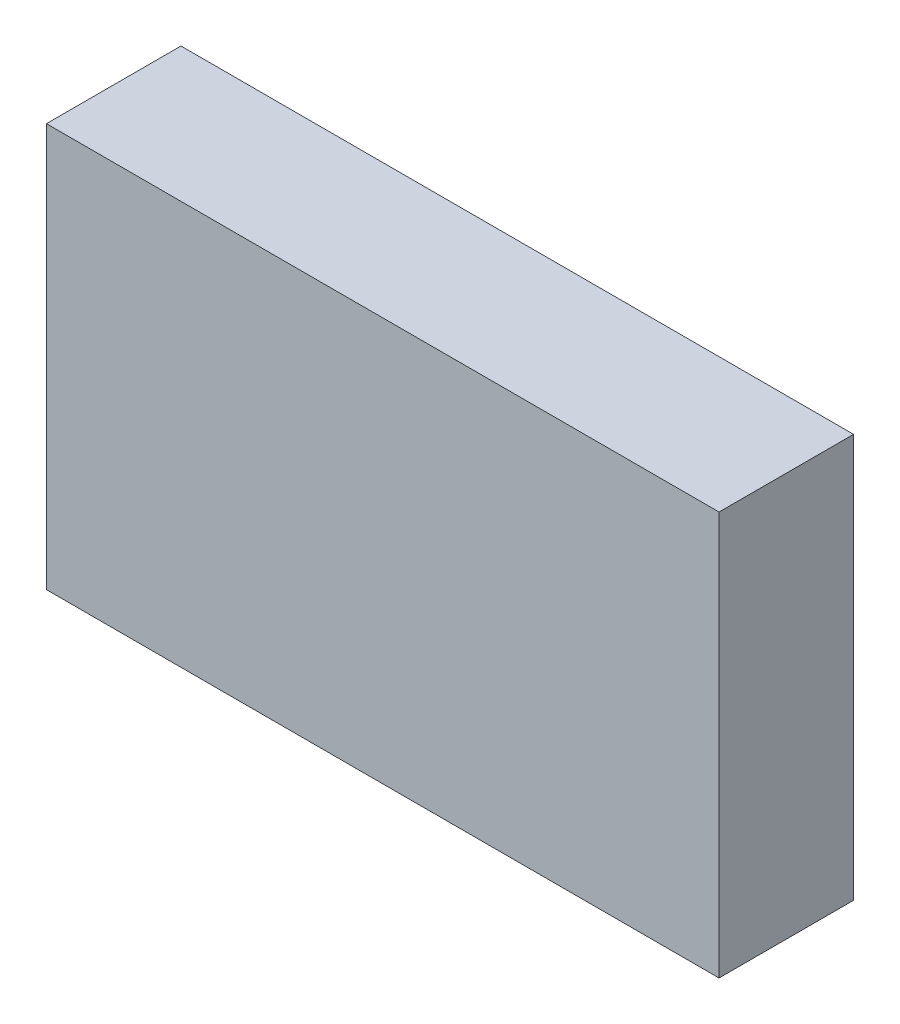
ISO-10303-21;
HEADER;
FILE_DESCRIPTION(('STEP AP214'),'2;1');
FILE_NAME('part.step','',(''),(''),'','','');
FILE_SCHEMA(('AUTOMOTIVE_DESIGN { 1 0 10303 214 1 1 1 1 }'));
ENDSEC;
DATA;
#1=APPLICATION_CONTEXT('core data for automotive mechanical design processes');
#2=APPLICATION_PROTOCOL_DEFINITION('international standard','automotive_design',2000,#1);
#3=PRODUCT_CONTEXT('',#1,'mechanical');
#4=PRODUCT('Part','Part','',(#3));
#5=PRODUCT_RELATED_PRODUCT_CATEGORY('part','',(#4));
#6=PRODUCT_DEFINITION_FORMATION('','',#4);
#7=PRODUCT_DEFINITION_CONTEXT('part definition',#1,'design');
#8=PRODUCT_DEFINITION('design','',#6,#7);
#9=PRODUCT_DEFINITION_SHAPE('','',#8);
#10=(LENGTH_UNIT() NAMED_UNIT(*) SI_UNIT(.MILLI.,.METRE.));
#11=(NAMED_UNIT(*) PLANE_ANGLE_UNIT() SI_UNIT($,.RADIAN.));
#12=(NAMED_UNIT(*) SI_UNIT($,.STERADIAN.) SOLID_ANGLE_UNIT());
#13=UNCERTAINTY_MEASURE_WITH_UNIT(LENGTH_MEASURE(1.E-05),#10,'distance_accuracy_value','');
#14=(GEOMETRIC_REPRESENTATION_CONTEXT(3) GLOBAL_UNCERTAINTY_ASSIGNED_CONTEXT((#13)) GLOBAL_UNIT_ASSIGNED_CONTEXT((#10,
#11,#12)) REPRESENTATION_CONTEXT('',''));
#15=CARTESIAN_POINT('',(0.,0.,0.));
#16=DIRECTION('',(0.,0.,1.));
#17=DIRECTION('',(1.,0.,0.));
#18=AXIS2_PLACEMENT_3D('',#15,#16,#17);
#19=CARTESIAN_POINT('',(0.,0.,20.));
#20=DIRECTION('',(1.,0.,0.));
#21=DIRECTION('',(0.,0.,-1.));
#22=AXIS2_PLACEMENT_3D('',#19,#20,#21);
#23=PLANE('',#22);
#24=DIRECTION('',(0.,-1.,0.));
#25=VECTOR('',#24,1.);
#26=CARTESIAN_POINT('',(0.,0.,0.));
#27=LINE('',#26,#25);
#28=CARTESIAN_POINT('',(0.,60.,0.));
#29=VERTEX_POINT('',#28);
#30=CARTESIAN_POINT('',(0.,0.,0.));
#31=VERTEX_POINT('',#30);
#32=EDGE_CURVE('E102',#29,#31,#27,.T.);
#33=ORIENTED_EDGE('',*,*,#32,.T.);
#34=DIRECTION('',(0.,0.,-1.));
#35=VECTOR('',#34,1.);
#36=CARTESIAN_POINT('',(0.,0.,20.));
#37=LINE('',#36,#35);
#38=CARTESIAN_POINT('',(0.,0.,20.));
#39=VERTEX_POINT('',#38);
#40=EDGE_CURVE('E11',#39,#31,#37,.T.);
#41=ORIENTED_EDGE('',*,*,#40,.F.);
#42=DIRECTION('',(0.,-1.,0.));
#43=VECTOR('',#42,1.);
#44=CARTESIAN_POINT('',(0.,0.,20.));
#45=LINE('',#44,#43);
#46=CARTESIAN_POINT('',(0.,60.,20.));
#47=VERTEX_POINT('',#46);
#48=EDGE_CURVE('E90',#47,#39,#45,.T.);
#49=ORIENTED_EDGE('',*,*,#48,.F.);
#50=DIRECTION('',(0.,0.,-1.));
#51=VECTOR('',#50,1.);
#52=CARTESIAN_POINT('',(0.,60.,20.));
#53=LINE('',#52,#51);
#54=EDGE_CURVE('E98',#47,#29,#53,.T.);
#55=ORIENTED_EDGE('',*,*,#54,.T.);
#56=EDGE_LOOP('',(#33,#41,#49,#55));
#57=FACE_BOUND('',#56,.T.);
#58=ADVANCED_FACE('F39',(#57),#23,.F.);
#59=CARTESIAN_POINT('',(0.,0.,20.));
#60=DIRECTION('',(0.,1.,0.));
#61=DIRECTION('',(0.,0.,1.));
#62=AXIS2_PLACEMENT_3D('',#59,#60,#61);
#63=PLANE('',#62);
#64=DIRECTION('',(1.,0.,0.));
#65=VECTOR('',#64,1.);
#66=CARTESIAN_POINT('',(0.,0.,0.));
#67=LINE('',#66,#65);
#68=CARTESIAN_POINT('',(100.,0.,0.));
#69=VERTEX_POINT('',#68);
#70=EDGE_CURVE('E94',#31,#69,#67,.T.);
#71=ORIENTED_EDGE('',*,*,#70,.T.);
#72=DIRECTION('',(0.,0.,-1.));
#73=VECTOR('',#72,1.);
#74=CARTESIAN_POINT('',(100.,0.,20.));
#75=LINE('',#74,#73);
#76=CARTESIAN_POINT('',(100.,0.,20.));
#77=VERTEX_POINT('',#76);
#78=EDGE_CURVE('E47',#77,#69,#75,.T.);
#79=ORIENTED_EDGE('',*,*,#78,.F.);
#80=DIRECTION('',(1.,0.,0.));
#81=VECTOR('',#80,1.);
#82=CARTESIAN_POINT('',(0.,0.,20.));
#83=LINE('',#82,#81);
#84=EDGE_CURVE('E85',#39,#77,#83,.T.);
#85=ORIENTED_EDGE('',*,*,#84,.F.);
#86=ORIENTED_EDGE('',*,*,#40,.T.);
#87=EDGE_LOOP('',(#71,#79,#85,#86));
#88=FACE_BOUND('',#87,.T.);
#89=ADVANCED_FACE('F93',(#88),#63,.F.);
#90=CARTESIAN_POINT('',(100.,0.,20.));
#91=DIRECTION('',(-1.,0.,0.));
#92=DIRECTION('',(0.,0.,1.));
#93=AXIS2_PLACEMENT_3D('',#90,#91,#92);
#94=PLANE('',#93);
#95=DIRECTION('',(0.,1.,0.));
#96=VECTOR('',#95,1.);
#97=CARTESIAN_POINT('',(100.,0.,0.));
#98=LINE('',#97,#96);
#99=CARTESIAN_POINT('',(100.,60.,0.));
#100=VERTEX_POINT('',#99);
#101=EDGE_CURVE('E72',#69,#100,#98,.T.);
#102=ORIENTED_EDGE('',*,*,#101,.T.);
#103=DIRECTION('',(0.,0.,-1.));
#104=VECTOR('',#103,1.);
#105=CARTESIAN_POINT('',(100.,60.,20.));
#106=LINE('',#105,#104);
#107=CARTESIAN_POINT('',(100.,60.,20.));
#108=VERTEX_POINT('',#107);
#109=EDGE_CURVE('E95',#108,#100,#106,.T.);
#110=ORIENTED_EDGE('',*,*,#109,.F.);
#111=DIRECTION('',(0.,1.,0.));
#112=VECTOR('',#111,1.);
#113=CARTESIAN_POINT('',(100.,0.,20.));
#114=LINE('',#113,#112);
#115=EDGE_CURVE('E88',#77,#108,#114,.T.);
#116=ORIENTED_EDGE('',*,*,#115,.F.);
#117=ORIENTED_EDGE('',*,*,#78,.T.);
#118=EDGE_LOOP('',(#102,#110,#116,#117));
#119=FACE_BOUND('',#118,.T.);
#120=ADVANCED_FACE('F96',(#119),#94,.F.);
#121=CARTESIAN_POINT('',(0.,60.,20.));
#122=DIRECTION('',(0.,-1.,0.));
#123=DIRECTION('',(0.,0.,-1.));
#124=AXIS2_PLACEMENT_3D('',#121,#122,#123);
#125=PLANE('',#124);
#126=DIRECTION('',(-1.,0.,0.));
#127=VECTOR('',#126,1.);
#128=CARTESIAN_POINT('',(0.,60.,0.));
#129=LINE('',#128,#127);
#130=EDGE_CURVE('E78',#100,#29,#129,.T.);
#131=ORIENTED_EDGE('',*,*,#130,.T.);
#132=ORIENTED_EDGE('',*,*,#54,.F.);
#133=DIRECTION('',(-1.,0.,0.));
#134=VECTOR('',#133,1.);
#135=CARTESIAN_POINT('',(0.,60.,20.));
#136=LINE('',#135,#134);
#137=EDGE_CURVE('E55',#108,#47,#136,.T.);
#138=ORIENTED_EDGE('',*,*,#137,.F.);
#139=ORIENTED_EDGE('',*,*,#109,.T.);
#140=EDGE_LOOP('',(#131,#132,#138,#139));
#141=FACE_BOUND('',#140,.T.);
#142=ADVANCED_FACE('F109',(#141),#125,.F.);
#143=CARTESIAN_POINT('',(0.,0.,20.));
#144=DIRECTION('',(0.,0.,-1.));
#145=DIRECTION('',(-1.,0.,0.));
#146=AXIS2_PLACEMENT_3D('',#143,#144,#145);
#147=PLANE('',#146);
#148=ORIENTED_EDGE('',*,*,#48,.T.);
#149=ORIENTED_EDGE('',*,*,#84,.T.);
#150=ORIENTED_EDGE('',*,*,#115,.T.);
#151=ORIENTED_EDGE('',*,*,#137,.T.);
#152=EDGE_LOOP('',(#148,#149,#150,#151));
#153=FACE_BOUND('',#152,.T.);
#154=ADVANCED_FACE('F86',(#153),#147,.F.);
#155=CARTESIAN_POINT('',(0.,0.,0.));
#156=DIRECTION('',(0.,0.,-1.));
#157=DIRECTION('',(-1.,0.,0.));
#158=AXIS2_PLACEMENT_3D('',#155,#156,#157);
#159=PLANE('',#158);
#160=ORIENTED_EDGE('',*,*,#32,.F.);
#161=ORIENTED_EDGE('',*,*,#130,.F.);
#162=ORIENTED_EDGE('',*,*,#101,.F.);
#163=ORIENTED_EDGE('',*,*,#70,.F.);
#164=EDGE_LOOP('',(#160,#161,#162,#163));
#165=FACE_BOUND('',#164,.T.);
#166=ADVANCED_FACE('F112',(#165),#159,.T.);
#167=CLOSED_SHELL('',(#58,#89,#120,#142,#154,#166));
#168=MANIFOLD_SOLID_BREP('B2',#167);
#169=ADVANCED_BREP_SHAPE_REPRESENTATION('',(#18,#168),#14);
#170=SHAPE_DEFINITION_REPRESENTATION(#9,#169);
ENDSEC;
END-ISO-10303-21;
